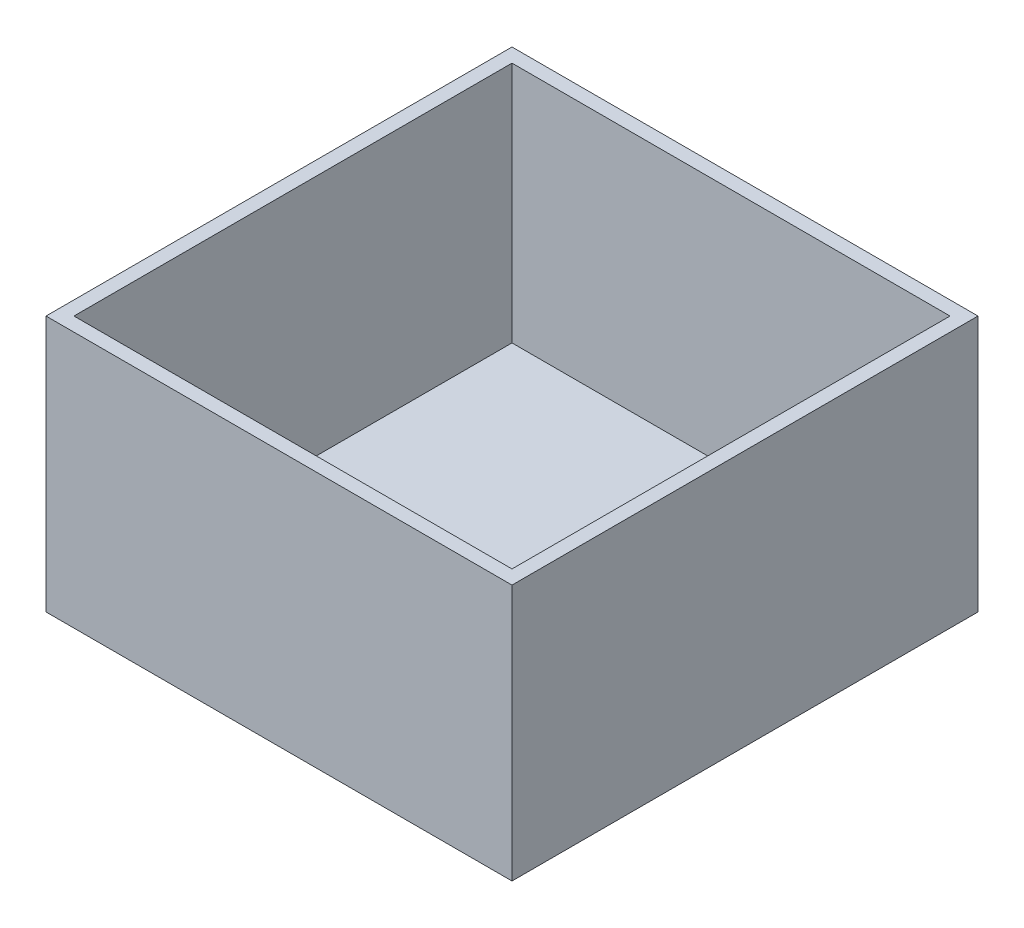
ISO-10303-21;
HEADER;
FILE_DESCRIPTION(('STEP AP214'),'2;1');
FILE_NAME('part.step','',(''),(''),'','','');
FILE_SCHEMA(('AUTOMOTIVE_DESIGN { 1 0 10303 214 1 1 1 1 }'));
ENDSEC;
DATA;
#1=APPLICATION_CONTEXT('core data for automotive mechanical design processes');
#2=APPLICATION_PROTOCOL_DEFINITION('international standard','automotive_design',2000,#1);
#3=PRODUCT_CONTEXT('',#1,'mechanical');
#4=PRODUCT('Part','Part','',(#3));
#5=PRODUCT_RELATED_PRODUCT_CATEGORY('part','',(#4));
#6=PRODUCT_DEFINITION_FORMATION('','',#4);
#7=PRODUCT_DEFINITION_CONTEXT('part definition',#1,'design');
#8=PRODUCT_DEFINITION('design','',#6,#7);
#9=PRODUCT_DEFINITION_SHAPE('','',#8);
#10=(LENGTH_UNIT() NAMED_UNIT(*) SI_UNIT(.MILLI.,.METRE.));
#11=(NAMED_UNIT(*) PLANE_ANGLE_UNIT() SI_UNIT($,.RADIAN.));
#12=(NAMED_UNIT(*) SI_UNIT($,.STERADIAN.) SOLID_ANGLE_UNIT());
#13=UNCERTAINTY_MEASURE_WITH_UNIT(LENGTH_MEASURE(1.E-05),#10,'distance_accuracy_value','');
#14=(GEOMETRIC_REPRESENTATION_CONTEXT(3) GLOBAL_UNCERTAINTY_ASSIGNED_CONTEXT((#13)) GLOBAL_UNIT_ASSIGNED_CONTEXT((#10,
#11,#12)) REPRESENTATION_CONTEXT('',''));
#15=CARTESIAN_POINT('',(0.,0.,0.));
#16=DIRECTION('',(0.,0.,1.));
#17=DIRECTION('',(1.,0.,0.));
#18=AXIS2_PLACEMENT_3D('',#15,#16,#17);
#19=CARTESIAN_POINT('',(0.,0.,45.));
#20=DIRECTION('',(0.,0.,1.));
#21=DIRECTION('',(1.,0.,0.));
#22=AXIS2_PLACEMENT_3D('',#19,#20,#21);
#23=PLANE('',#22);
#24=DIRECTION('',(0.,1.,0.));
#25=VECTOR('',#24,1.);
#26=CARTESIAN_POINT('',(19.8,0.2,45.));
#27=LINE('',#26,#25);
#28=CARTESIAN_POINT('',(19.8,0.2,45.));
#29=VERTEX_POINT('',#28);
#30=CARTESIAN_POINT('',(19.8,19.8,45.));
#31=VERTEX_POINT('',#30);
#32=EDGE_CURVE('E242',#29,#31,#27,.T.);
#33=ORIENTED_EDGE('',*,*,#32,.T.);
#34=DIRECTION('',(-1.,0.,0.));
#35=VECTOR('',#34,1.);
#36=CARTESIAN_POINT('',(19.8,19.8,45.));
#37=LINE('',#36,#35);
#38=CARTESIAN_POINT('',(0.2,19.8,45.));
#39=VERTEX_POINT('',#38);
#40=EDGE_CURVE('E250',#31,#39,#37,.T.);
#41=ORIENTED_EDGE('',*,*,#40,.T.);
#42=DIRECTION('',(0.,1.,0.));
#43=VECTOR('',#42,1.);
#44=CARTESIAN_POINT('',(0.2,0.2,45.));
#45=LINE('',#44,#43);
#46=CARTESIAN_POINT('',(0.2,0.2,45.));
#47=VERTEX_POINT('',#46);
#48=EDGE_CURVE('E253',#47,#39,#45,.T.);
#49=ORIENTED_EDGE('',*,*,#48,.F.);
#50=DIRECTION('',(-1.,0.,0.));
#51=VECTOR('',#50,1.);
#52=CARTESIAN_POINT('',(19.8,0.2,45.));
#53=LINE('',#52,#51);
#54=EDGE_CURVE('E256',#29,#47,#53,.T.);
#55=ORIENTED_EDGE('',*,*,#54,.F.);
#56=EDGE_LOOP('',(#33,#41,#49,#55));
#57=FACE_BOUND('',#56,.T.);
#58=DIRECTION('',(1.,0.,0.));
#59=VECTOR('',#58,1.);
#60=CARTESIAN_POINT('',(-40.,45.,45.));
#61=LINE('',#60,#59);
#62=CARTESIAN_POINT('',(-40.,45.,45.));
#63=VERTEX_POINT('',#62);
#64=CARTESIAN_POINT('',(60.,45.,45.));
#65=VERTEX_POINT('',#64);
#66=EDGE_CURVE('E174',#63,#65,#61,.T.);
#67=ORIENTED_EDGE('',*,*,#66,.T.);
#68=DIRECTION('',(0.,1.,0.));
#69=VECTOR('',#68,1.);
#70=CARTESIAN_POINT('',(60.,-10.,45.));
#71=LINE('',#70,#69);
#72=CARTESIAN_POINT('',(60.,-10.,45.));
#73=VERTEX_POINT('',#72);
#74=EDGE_CURVE('E223',#73,#65,#71,.T.);
#75=ORIENTED_EDGE('',*,*,#74,.F.);
#76=DIRECTION('',(1.,0.,0.));
#77=VECTOR('',#76,1.);
#78=CARTESIAN_POINT('',(-40.,-10.,45.));
#79=LINE('',#78,#77);
#80=CARTESIAN_POINT('',(-40.,-10.,45.));
#81=VERTEX_POINT('',#80);
#82=EDGE_CURVE('E226',#81,#73,#79,.T.);
#83=ORIENTED_EDGE('',*,*,#82,.F.);
#84=DIRECTION('',(0.,1.,0.));
#85=VECTOR('',#84,1.);
#86=CARTESIAN_POINT('',(-40.,-10.,45.));
#87=LINE('',#86,#85);
#88=EDGE_CURVE('E178',#81,#63,#87,.T.);
#89=ORIENTED_EDGE('',*,*,#88,.T.);
#90=EDGE_LOOP('',(#67,#75,#83,#89));
#91=FACE_BOUND('',#90,.T.);
#92=ADVANCED_FACE('F77',(#57,#91),#23,.F.);
#93=CARTESIAN_POINT('',(19.8,19.8,30.));
#94=DIRECTION('',(0.,1.,0.));
#95=DIRECTION('',(0.,0.,1.));
#96=AXIS2_PLACEMENT_3D('',#93,#94,#95);
#97=PLANE('',#96);
#98=CARTESIAN_POINT('',(10.,19.8,37.5));
#99=DIRECTION('',(0.,1.,0.));
#100=DIRECTION('',(0.,0.,1.));
#101=AXIS2_PLACEMENT_3D('',#98,#99,#100);
#102=CIRCLE('',#101,1.55);
#103=CARTESIAN_POINT('',(10.,19.8,39.05));
#104=VERTEX_POINT('',#103);
#105=EDGE_CURVE('E235',#104,#104,#102,.T.);
#106=ORIENTED_EDGE('',*,*,#105,.F.);
#107=EDGE_LOOP('',(#106));
#108=FACE_BOUND('',#107,.T.);
#109=ORIENTED_EDGE('',*,*,#40,.F.);
#110=DIRECTION('',(0.,0.,1.));
#111=VECTOR('',#110,1.);
#112=CARTESIAN_POINT('',(19.8,19.8,30.));
#113=LINE('',#112,#111);
#114=CARTESIAN_POINT('',(19.8,19.8,30.));
#115=VERTEX_POINT('',#114);
#116=EDGE_CURVE('E12',#115,#31,#113,.T.);
#117=ORIENTED_EDGE('',*,*,#116,.F.);
#118=DIRECTION('',(-1.,0.,0.));
#119=VECTOR('',#118,1.);
#120=CARTESIAN_POINT('',(19.8,19.8,30.));
#121=LINE('',#120,#119);
#122=CARTESIAN_POINT('',(0.2,19.8,30.));
#123=VERTEX_POINT('',#122);
#124=EDGE_CURVE('E238',#115,#123,#121,.T.);
#125=ORIENTED_EDGE('',*,*,#124,.T.);
#126=DIRECTION('',(0.,0.,1.));
#127=VECTOR('',#126,1.);
#128=CARTESIAN_POINT('',(0.2,19.8,30.));
#129=LINE('',#128,#127);
#130=EDGE_CURVE('E249',#123,#39,#129,.T.);
#131=ORIENTED_EDGE('',*,*,#130,.T.);
#132=EDGE_LOOP('',(#109,#117,#125,#131));
#133=FACE_BOUND('',#132,.T.);
#134=ADVANCED_FACE('F265',(#108,#133),#97,.T.);
#135=CARTESIAN_POINT('',(19.8,0.2,30.));
#136=DIRECTION('',(1.,0.,0.));
#137=DIRECTION('',(0.,0.,-1.));
#138=AXIS2_PLACEMENT_3D('',#135,#136,#137);
#139=PLANE('',#138);
#140=ORIENTED_EDGE('',*,*,#32,.F.);
#141=DIRECTION('',(0.,0.,1.));
#142=VECTOR('',#141,1.);
#143=CARTESIAN_POINT('',(19.8,0.2,30.));
#144=LINE('',#143,#142);
#145=CARTESIAN_POINT('',(19.8,0.2,30.));
#146=VERTEX_POINT('',#145);
#147=EDGE_CURVE('E85',#146,#29,#144,.T.);
#148=ORIENTED_EDGE('',*,*,#147,.F.);
#149=DIRECTION('',(0.,1.,0.));
#150=VECTOR('',#149,1.);
#151=CARTESIAN_POINT('',(19.8,0.2,30.));
#152=LINE('',#151,#150);
#153=EDGE_CURVE('E246',#146,#115,#152,.T.);
#154=ORIENTED_EDGE('',*,*,#153,.T.);
#155=ORIENTED_EDGE('',*,*,#116,.T.);
#156=EDGE_LOOP('',(#140,#148,#154,#155));
#157=FACE_BOUND('',#156,.T.);
#158=ADVANCED_FACE('F277',(#157),#139,.T.);
#159=CARTESIAN_POINT('',(19.8,0.2,30.));
#160=DIRECTION('',(0.,1.,0.));
#161=DIRECTION('',(0.,0.,1.));
#162=AXIS2_PLACEMENT_3D('',#159,#160,#161);
#163=PLANE('',#162);
#164=CARTESIAN_POINT('',(10.,0.2,37.5));
#165=DIRECTION('',(0.,1.,0.));
#166=DIRECTION('',(0.,0.,1.));
#167=AXIS2_PLACEMENT_3D('',#164,#165,#166);
#168=CIRCLE('',#167,1.55);
#169=CARTESIAN_POINT('',(10.,0.2,39.05));
#170=VERTEX_POINT('',#169);
#171=EDGE_CURVE('E80',#170,#170,#168,.T.);
#172=ORIENTED_EDGE('',*,*,#171,.T.);
#173=EDGE_LOOP('',(#172));
#174=FACE_BOUND('',#173,.T.);
#175=ORIENTED_EDGE('',*,*,#54,.T.);
#176=DIRECTION('',(0.,0.,1.));
#177=VECTOR('',#176,1.);
#178=CARTESIAN_POINT('',(0.2,0.2,30.));
#179=LINE('',#178,#177);
#180=CARTESIAN_POINT('',(0.2,0.2,30.));
#181=VERTEX_POINT('',#180);
#182=EDGE_CURVE('E261',#181,#47,#179,.T.);
#183=ORIENTED_EDGE('',*,*,#182,.F.);
#184=DIRECTION('',(-1.,0.,0.));
#185=VECTOR('',#184,1.);
#186=CARTESIAN_POINT('',(19.8,0.2,30.));
#187=LINE('',#186,#185);
#188=EDGE_CURVE('E244',#146,#181,#187,.T.);
#189=ORIENTED_EDGE('',*,*,#188,.F.);
#190=ORIENTED_EDGE('',*,*,#147,.T.);
#191=EDGE_LOOP('',(#175,#183,#189,#190));
#192=FACE_BOUND('',#191,.T.);
#193=ADVANCED_FACE('F283',(#174,#192),#163,.F.);
#194=CARTESIAN_POINT('',(0.2,0.2,30.));
#195=DIRECTION('',(1.,0.,0.));
#196=DIRECTION('',(0.,0.,-1.));
#197=AXIS2_PLACEMENT_3D('',#194,#195,#196);
#198=PLANE('',#197);
#199=ORIENTED_EDGE('',*,*,#48,.T.);
#200=ORIENTED_EDGE('',*,*,#130,.F.);
#201=DIRECTION('',(0.,1.,0.));
#202=VECTOR('',#201,1.);
#203=CARTESIAN_POINT('',(0.2,0.2,30.));
#204=LINE('',#203,#202);
#205=EDGE_CURVE('E241',#181,#123,#204,.T.);
#206=ORIENTED_EDGE('',*,*,#205,.F.);
#207=ORIENTED_EDGE('',*,*,#182,.T.);
#208=EDGE_LOOP('',(#199,#200,#206,#207));
#209=FACE_BOUND('',#208,.T.);
#210=ADVANCED_FACE('F270',(#209),#198,.F.);
#211=CARTESIAN_POINT('',(0.,0.,30.));
#212=DIRECTION('',(0.,0.,-1.));
#213=DIRECTION('',(-1.,0.,0.));
#214=AXIS2_PLACEMENT_3D('',#211,#212,#213);
#215=PLANE('',#214);
#216=ORIENTED_EDGE('',*,*,#124,.F.);
#217=ORIENTED_EDGE('',*,*,#153,.F.);
#218=ORIENTED_EDGE('',*,*,#188,.T.);
#219=ORIENTED_EDGE('',*,*,#205,.T.);
#220=EDGE_LOOP('',(#216,#217,#218,#219));
#221=FACE_BOUND('',#220,.T.);
#222=ADVANCED_FACE('F281',(#221),#215,.T.);
#223=CARTESIAN_POINT('',(10.,-0.199999999999999,37.5));
#224=DIRECTION('',(0.,1.,0.));
#225=DIRECTION('',(0.,0.,1.));
#226=AXIS2_PLACEMENT_3D('',#223,#224,#225);
#227=CYLINDRICAL_SURFACE('',#226,1.55);
#228=ORIENTED_EDGE('',*,*,#105,.T.);
#229=EDGE_LOOP('',(#228));
#230=FACE_BOUND('',#229,.T.);
#231=ORIENTED_EDGE('',*,*,#171,.F.);
#232=EDGE_LOOP('',(#231));
#233=FACE_BOUND('',#232,.T.);
#234=ADVANCED_FACE('F305',(#230,#233),#227,.F.);
#235=CARTESIAN_POINT('',(-40.,45.,45.));
#236=DIRECTION('',(0.,-1.,0.));
#237=DIRECTION('',(0.,0.,-1.));
#238=AXIS2_PLACEMENT_3D('',#235,#236,#237);
#239=PLANE('',#238);
#240=DIRECTION('',(1.,0.,0.));
#241=VECTOR('',#240,1.);
#242=CARTESIAN_POINT('',(-40.,45.,142.));
#243=LINE('',#242,#241);
#244=CARTESIAN_POINT('',(-37.,45.,142.));
#245=VERTEX_POINT('',#244);
#246=CARTESIAN_POINT('',(57.,45.,142.));
#247=VERTEX_POINT('',#246);
#248=EDGE_CURVE('E192',#245,#247,#243,.T.);
#249=ORIENTED_EDGE('',*,*,#248,.F.);
#250=DIRECTION('',(0.,0.,-1.));
#251=VECTOR('',#250,1.);
#252=CARTESIAN_POINT('',(-37.,45.,142.));
#253=LINE('',#252,#251);
#254=CARTESIAN_POINT('',(-37.,45.,48.));
#255=VERTEX_POINT('',#254);
#256=EDGE_CURVE('E207',#245,#255,#253,.T.);
#257=ORIENTED_EDGE('',*,*,#256,.T.);
#258=DIRECTION('',(-1.,0.,0.));
#259=VECTOR('',#258,1.);
#260=CARTESIAN_POINT('',(960.,45.,48.));
#261=LINE('',#260,#259);
#262=CARTESIAN_POINT('',(57.,45.,48.));
#263=VERTEX_POINT('',#262);
#264=EDGE_CURVE('E98',#263,#255,#261,.T.);
#265=ORIENTED_EDGE('',*,*,#264,.F.);
#266=DIRECTION('',(0.,0.,-1.));
#267=VECTOR('',#266,1.);
#268=CARTESIAN_POINT('',(57.,45.,142.));
#269=LINE('',#268,#267);
#270=EDGE_CURVE('E211',#247,#263,#269,.T.);
#271=ORIENTED_EDGE('',*,*,#270,.F.);
#272=EDGE_LOOP('',(#249,#257,#265,#271));
#273=FACE_BOUND('',#272,.T.);
#274=DIRECTION('',(0.,0.,1.));
#275=VECTOR('',#274,1.);
#276=CARTESIAN_POINT('',(-40.,45.,45.));
#277=LINE('',#276,#275);
#278=CARTESIAN_POINT('',(-40.,45.,145.));
#279=VERTEX_POINT('',#278);
#280=EDGE_CURVE('E167',#63,#279,#277,.T.);
#281=ORIENTED_EDGE('',*,*,#280,.T.);
#282=DIRECTION('',(1.,0.,0.));
#283=VECTOR('',#282,1.);
#284=CARTESIAN_POINT('',(-40.,45.,145.));
#285=LINE('',#284,#283);
#286=CARTESIAN_POINT('',(60.,45.,145.));
#287=VERTEX_POINT('',#286);
#288=EDGE_CURVE('E172',#279,#287,#285,.T.);
#289=ORIENTED_EDGE('',*,*,#288,.T.);
#290=DIRECTION('',(0.,0.,1.));
#291=VECTOR('',#290,1.);
#292=CARTESIAN_POINT('',(60.,45.,45.));
#293=LINE('',#292,#291);
#294=EDGE_CURVE('E233',#65,#287,#293,.T.);
#295=ORIENTED_EDGE('',*,*,#294,.F.);
#296=ORIENTED_EDGE('',*,*,#66,.F.);
#297=EDGE_LOOP('',(#281,#289,#295,#296));
#298=FACE_BOUND('',#297,.T.);
#299=ADVANCED_FACE('F169',(#273,#298),#239,.F.);
#300=CARTESIAN_POINT('',(60.,-10.,45.));
#301=DIRECTION('',(1.,0.,0.));
#302=DIRECTION('',(0.,0.,-1.));
#303=AXIS2_PLACEMENT_3D('',#300,#301,#302);
#304=PLANE('',#303);
#305=ORIENTED_EDGE('',*,*,#294,.T.);
#306=DIRECTION('',(0.,1.,0.));
#307=VECTOR('',#306,1.);
#308=CARTESIAN_POINT('',(60.,-10.,145.));
#309=LINE('',#308,#307);
#310=CARTESIAN_POINT('',(60.,-10.,145.));
#311=VERTEX_POINT('',#310);
#312=EDGE_CURVE('E186',#311,#287,#309,.T.);
#313=ORIENTED_EDGE('',*,*,#312,.F.);
#314=DIRECTION('',(0.,0.,1.));
#315=VECTOR('',#314,1.);
#316=CARTESIAN_POINT('',(60.,-10.,45.));
#317=LINE('',#316,#315);
#318=EDGE_CURVE('E231',#73,#311,#317,.T.);
#319=ORIENTED_EDGE('',*,*,#318,.F.);
#320=ORIENTED_EDGE('',*,*,#74,.T.);
#321=EDGE_LOOP('',(#305,#313,#319,#320));
#322=FACE_BOUND('',#321,.T.);
#323=ADVANCED_FACE('F312',(#322),#304,.T.);
#324=CARTESIAN_POINT('',(-40.,-10.,45.));
#325=DIRECTION('',(0.,-1.,0.));
#326=DIRECTION('',(0.,0.,-1.));
#327=AXIS2_PLACEMENT_3D('',#324,#325,#326);
#328=PLANE('',#327);
#329=ORIENTED_EDGE('',*,*,#318,.T.);
#330=DIRECTION('',(1.,0.,0.));
#331=VECTOR('',#330,1.);
#332=CARTESIAN_POINT('',(-40.,-10.,145.));
#333=LINE('',#332,#331);
#334=CARTESIAN_POINT('',(-40.,-10.,145.));
#335=VERTEX_POINT('',#334);
#336=EDGE_CURVE('E190',#335,#311,#333,.T.);
#337=ORIENTED_EDGE('',*,*,#336,.F.);
#338=DIRECTION('',(0.,0.,1.));
#339=VECTOR('',#338,1.);
#340=CARTESIAN_POINT('',(-40.,-10.,45.));
#341=LINE('',#340,#339);
#342=EDGE_CURVE('E177',#81,#335,#341,.T.);
#343=ORIENTED_EDGE('',*,*,#342,.F.);
#344=ORIENTED_EDGE('',*,*,#82,.T.);
#345=EDGE_LOOP('',(#329,#337,#343,#344));
#346=FACE_BOUND('',#345,.T.);
#347=ADVANCED_FACE('F319',(#346),#328,.T.);
#348=CARTESIAN_POINT('',(-40.,-10.,45.));
#349=DIRECTION('',(1.,0.,0.));
#350=DIRECTION('',(0.,0.,-1.));
#351=AXIS2_PLACEMENT_3D('',#348,#349,#350);
#352=PLANE('',#351);
#353=ORIENTED_EDGE('',*,*,#342,.T.);
#354=DIRECTION('',(0.,1.,0.));
#355=VECTOR('',#354,1.);
#356=CARTESIAN_POINT('',(-40.,-10.,145.));
#357=LINE('',#356,#355);
#358=EDGE_CURVE('E181',#335,#279,#357,.T.);
#359=ORIENTED_EDGE('',*,*,#358,.T.);
#360=ORIENTED_EDGE('',*,*,#280,.F.);
#361=ORIENTED_EDGE('',*,*,#88,.F.);
#362=EDGE_LOOP('',(#353,#359,#360,#361));
#363=FACE_BOUND('',#362,.T.);
#364=ADVANCED_FACE('F182',(#363),#352,.F.);
#365=CARTESIAN_POINT('',(960.,45.,48.));
#366=DIRECTION('',(0.,0.,-1.));
#367=DIRECTION('',(0.,1.,0.));
#368=AXIS2_PLACEMENT_3D('',#365,#366,#367);
#369=PLANE('',#368);
#370=ORIENTED_EDGE('',*,*,#264,.T.);
#371=DIRECTION('',(0.,-1.,0.));
#372=VECTOR('',#371,1.);
#373=CARTESIAN_POINT('',(-37.,45.,48.));
#374=LINE('',#373,#372);
#375=CARTESIAN_POINT('',(-37.,-7.,48.));
#376=VERTEX_POINT('',#375);
#377=EDGE_CURVE('E93',#255,#376,#374,.T.);
#378=ORIENTED_EDGE('',*,*,#377,.T.);
#379=DIRECTION('',(1.,0.,0.));
#380=VECTOR('',#379,1.);
#381=CARTESIAN_POINT('',(0.,-7.,48.));
#382=LINE('',#381,#380);
#383=CARTESIAN_POINT('',(57.,-7.,48.));
#384=VERTEX_POINT('',#383);
#385=EDGE_CURVE('E200',#376,#384,#382,.T.);
#386=ORIENTED_EDGE('',*,*,#385,.T.);
#387=DIRECTION('',(0.,-1.,0.));
#388=VECTOR('',#387,1.);
#389=CARTESIAN_POINT('',(57.0000000000001,0.,48.));
#390=LINE('',#389,#388);
#391=EDGE_CURVE('E204',#263,#384,#390,.T.);
#392=ORIENTED_EDGE('',*,*,#391,.F.);
#393=EDGE_LOOP('',(#370,#378,#386,#392));
#394=FACE_BOUND('',#393,.T.);
#395=ADVANCED_FACE('F326',(#394),#369,.F.);
#396=CARTESIAN_POINT('',(57.0000000000001,0.,142.));
#397=DIRECTION('',(1.,0.,0.));
#398=DIRECTION('',(0.,1.,0.));
#399=AXIS2_PLACEMENT_3D('',#396,#397,#398);
#400=PLANE('',#399);
#401=ORIENTED_EDGE('',*,*,#391,.T.);
#402=DIRECTION('',(0.,0.,-1.));
#403=VECTOR('',#402,1.);
#404=CARTESIAN_POINT('',(57.,-7.,142.));
#405=LINE('',#404,#403);
#406=CARTESIAN_POINT('',(57.,-7.,142.));
#407=VERTEX_POINT('',#406);
#408=EDGE_CURVE('E203',#407,#384,#405,.T.);
#409=ORIENTED_EDGE('',*,*,#408,.F.);
#410=DIRECTION('',(0.,-1.,0.));
#411=VECTOR('',#410,1.);
#412=CARTESIAN_POINT('',(57.0000000000001,0.,142.));
#413=LINE('',#412,#411);
#414=EDGE_CURVE('E196',#247,#407,#413,.T.);
#415=ORIENTED_EDGE('',*,*,#414,.F.);
#416=ORIENTED_EDGE('',*,*,#270,.T.);
#417=EDGE_LOOP('',(#401,#409,#415,#416));
#418=FACE_BOUND('',#417,.T.);
#419=ADVANCED_FACE('F329',(#418),#400,.F.);
#420=CARTESIAN_POINT('',(0.,-7.,142.));
#421=DIRECTION('',(0.,1.,0.));
#422=DIRECTION('',(0.,0.,1.));
#423=AXIS2_PLACEMENT_3D('',#420,#421,#422);
#424=PLANE('',#423);
#425=DIRECTION('',(0.,0.,-1.));
#426=VECTOR('',#425,1.);
#427=CARTESIAN_POINT('',(-37.,-7.,142.));
#428=LINE('',#427,#426);
#429=CARTESIAN_POINT('',(-37.,-7.,142.));
#430=VERTEX_POINT('',#429);
#431=EDGE_CURVE('E214',#430,#376,#428,.T.);
#432=ORIENTED_EDGE('',*,*,#431,.F.);
#433=DIRECTION('',(1.,0.,0.));
#434=VECTOR('',#433,1.);
#435=CARTESIAN_POINT('',(0.,-7.,142.));
#436=LINE('',#435,#434);
#437=EDGE_CURVE('E199',#430,#407,#436,.T.);
#438=ORIENTED_EDGE('',*,*,#437,.T.);
#439=ORIENTED_EDGE('',*,*,#408,.T.);
#440=ORIENTED_EDGE('',*,*,#385,.F.);
#441=EDGE_LOOP('',(#432,#438,#439,#440));
#442=FACE_BOUND('',#441,.T.);
#443=ADVANCED_FACE('F334',(#442),#424,.T.);
#444=CARTESIAN_POINT('',(-37.,45.,142.));
#445=DIRECTION('',(1.,0.,0.));
#446=DIRECTION('',(0.,1.,0.));
#447=AXIS2_PLACEMENT_3D('',#444,#445,#446);
#448=PLANE('',#447);
#449=DIRECTION('',(0.,-1.,0.));
#450=VECTOR('',#449,1.);
#451=CARTESIAN_POINT('',(-37.,45.,142.));
#452=LINE('',#451,#450);
#453=EDGE_CURVE('E215',#245,#430,#452,.T.);
#454=ORIENTED_EDGE('',*,*,#453,.T.);
#455=ORIENTED_EDGE('',*,*,#431,.T.);
#456=ORIENTED_EDGE('',*,*,#377,.F.);
#457=ORIENTED_EDGE('',*,*,#256,.F.);
#458=EDGE_LOOP('',(#454,#455,#456,#457));
#459=FACE_BOUND('',#458,.T.);
#460=ADVANCED_FACE('F330',(#459),#448,.T.);
#461=CARTESIAN_POINT('',(-40.,-10.,142.));
#462=DIRECTION('',(0.,0.,-1.));
#463=DIRECTION('',(-1.,0.,0.));
#464=AXIS2_PLACEMENT_3D('',#461,#462,#463);
#465=PLANE('',#464);
#466=ORIENTED_EDGE('',*,*,#453,.F.);
#467=ORIENTED_EDGE('',*,*,#248,.T.);
#468=ORIENTED_EDGE('',*,*,#414,.T.);
#469=ORIENTED_EDGE('',*,*,#437,.F.);
#470=EDGE_LOOP('',(#466,#467,#468,#469));
#471=FACE_BOUND('',#470,.T.);
#472=ADVANCED_FACE('F333',(#471),#465,.T.);
#473=CARTESIAN_POINT('',(-40.,-10.,145.));
#474=DIRECTION('',(0.,0.,-1.));
#475=DIRECTION('',(-1.,0.,0.));
#476=AXIS2_PLACEMENT_3D('',#473,#474,#475);
#477=PLANE('',#476);
#478=ORIENTED_EDGE('',*,*,#312,.T.);
#479=ORIENTED_EDGE('',*,*,#288,.F.);
#480=ORIENTED_EDGE('',*,*,#358,.F.);
#481=ORIENTED_EDGE('',*,*,#336,.T.);
#482=EDGE_LOOP('',(#478,#479,#480,#481));
#483=FACE_BOUND('',#482,.T.);
#484=ADVANCED_FACE('F188',(#483),#477,.F.);
#485=CLOSED_SHELL('',(#92,#134,#158,#193,#210,#222,#234,#299,#323,#347,#364,#395,#419,#443,#460,
#472,#484));
#486=MANIFOLD_SOLID_BREP('B2',#485);
#487=ADVANCED_BREP_SHAPE_REPRESENTATION('',(#18,#486),#14);
#488=SHAPE_DEFINITION_REPRESENTATION(#9,#487);
ENDSEC;
END-ISO-10303-21;
